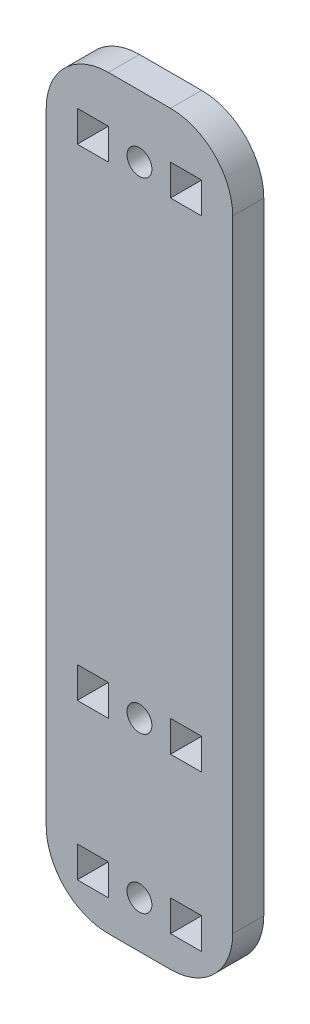
ISO-10303-21;
HEADER;
FILE_DESCRIPTION(('STEP AP214'),'2;1');
FILE_NAME('part.step','',(''),(''),'','','');
FILE_SCHEMA(('AUTOMOTIVE_DESIGN { 1 0 10303 214 1 1 1 1 }'));
ENDSEC;
DATA;
#1=APPLICATION_CONTEXT('core data for automotive mechanical design processes');
#2=APPLICATION_PROTOCOL_DEFINITION('international standard','automotive_design',2000,#1);
#3=PRODUCT_CONTEXT('',#1,'mechanical');
#4=PRODUCT('Part','Part','',(#3));
#5=PRODUCT_RELATED_PRODUCT_CATEGORY('part','',(#4));
#6=PRODUCT_DEFINITION_FORMATION('','',#4);
#7=PRODUCT_DEFINITION_CONTEXT('part definition',#1,'design');
#8=PRODUCT_DEFINITION('design','',#6,#7);
#9=PRODUCT_DEFINITION_SHAPE('','',#8);
#10=(LENGTH_UNIT() NAMED_UNIT(*) SI_UNIT(.MILLI.,.METRE.));
#11=(NAMED_UNIT(*) PLANE_ANGLE_UNIT() SI_UNIT($,.RADIAN.));
#12=(NAMED_UNIT(*) SI_UNIT($,.STERADIAN.) SOLID_ANGLE_UNIT());
#13=UNCERTAINTY_MEASURE_WITH_UNIT(LENGTH_MEASURE(1.E-05),#10,'distance_accuracy_value','');
#14=(GEOMETRIC_REPRESENTATION_CONTEXT(3) GLOBAL_UNCERTAINTY_ASSIGNED_CONTEXT((#13)) GLOBAL_UNIT_ASSIGNED_CONTEXT((#10,
#11,#12)) REPRESENTATION_CONTEXT('',''));
#15=CARTESIAN_POINT('',(0.,0.,0.));
#16=DIRECTION('',(0.,0.,1.));
#17=DIRECTION('',(1.,0.,0.));
#18=AXIS2_PLACEMENT_3D('',#15,#16,#17);
#19=CARTESIAN_POINT('',(0.,0.,5.));
#20=DIRECTION('',(0.,0.,1.));
#21=DIRECTION('',(1.,0.,0.));
#22=AXIS2_PLACEMENT_3D('',#19,#20,#21);
#23=PLANE('',#22);
#24=CARTESIAN_POINT('',(-15.,-87.5,5.));
#25=DIRECTION('',(0.,0.,1.));
#26=DIRECTION('',(1.,0.,0.));
#27=AXIS2_PLACEMENT_3D('',#24,#25,#26);
#28=CIRCLE('',#27,2.);
#29=CARTESIAN_POINT('',(-13.,-87.5,5.));
#30=VERTEX_POINT('',#29);
#31=EDGE_CURVE('E990',#30,#30,#28,.T.);
#32=ORIENTED_EDGE('',*,*,#31,.F.);
#33=EDGE_LOOP('',(#32));
#34=FACE_BOUND('',#33,.T.);
#35=DIRECTION('',(-1.,0.,0.));
#36=VECTOR('',#35,1.);
#37=CARTESIAN_POINT('',(-5.,-7.5,5.));
#38=LINE('',#37,#36);
#39=CARTESIAN_POINT('',(-5.,-7.5,5.));
#40=VERTEX_POINT('',#39);
#41=CARTESIAN_POINT('',(-10.,-7.5,5.));
#42=VERTEX_POINT('',#41);
#43=EDGE_CURVE('E262',#40,#42,#38,.T.);
#44=ORIENTED_EDGE('',*,*,#43,.F.);
#45=DIRECTION('',(0.,1.,0.));
#46=VECTOR('',#45,1.);
#47=CARTESIAN_POINT('',(-5.,-7.5,5.));
#48=LINE('',#47,#46);
#49=CARTESIAN_POINT('',(-5.,-12.5,5.));
#50=VERTEX_POINT('',#49);
#51=EDGE_CURVE('E251',#50,#40,#48,.T.);
#52=ORIENTED_EDGE('',*,*,#51,.F.);
#53=DIRECTION('',(1.,0.,0.));
#54=VECTOR('',#53,1.);
#55=CARTESIAN_POINT('',(-5.,-12.5,5.));
#56=LINE('',#55,#54);
#57=CARTESIAN_POINT('',(-10.,-12.5,5.));
#58=VERTEX_POINT('',#57);
#59=EDGE_CURVE('E281',#58,#50,#56,.T.);
#60=ORIENTED_EDGE('',*,*,#59,.F.);
#61=DIRECTION('',(0.,-1.,0.));
#62=VECTOR('',#61,1.);
#63=CARTESIAN_POINT('',(-10.,-7.5,5.));
#64=LINE('',#63,#62);
#65=EDGE_CURVE('E277',#42,#58,#64,.T.);
#66=ORIENTED_EDGE('',*,*,#65,.F.);
#67=EDGE_LOOP('',(#44,#52,#60,#66));
#68=FACE_BOUND('',#67,.T.);
#69=DIRECTION('',(-1.,0.,0.));
#70=VECTOR('',#69,1.);
#71=CARTESIAN_POINT('',(-20.,-7.5,5.));
#72=LINE('',#71,#70);
#73=CARTESIAN_POINT('',(-20.,-7.5,5.));
#74=VERTEX_POINT('',#73);
#75=CARTESIAN_POINT('',(-25.,-7.50000000000001,5.));
#76=VERTEX_POINT('',#75);
#77=EDGE_CURVE('E310',#74,#76,#72,.T.);
#78=ORIENTED_EDGE('',*,*,#77,.F.);
#79=DIRECTION('',(0.,1.,0.));
#80=VECTOR('',#79,1.);
#81=CARTESIAN_POINT('',(-20.,-7.5,5.));
#82=LINE('',#81,#80);
#83=CARTESIAN_POINT('',(-20.,-12.5,5.));
#84=VERTEX_POINT('',#83);
#85=EDGE_CURVE('E307',#84,#74,#82,.T.);
#86=ORIENTED_EDGE('',*,*,#85,.F.);
#87=DIRECTION('',(1.,0.,0.));
#88=VECTOR('',#87,1.);
#89=CARTESIAN_POINT('',(-20.,-12.5,5.));
#90=LINE('',#89,#88);
#91=CARTESIAN_POINT('',(-25.,-12.5,5.));
#92=VERTEX_POINT('',#91);
#93=EDGE_CURVE('E318',#92,#84,#90,.T.);
#94=ORIENTED_EDGE('',*,*,#93,.F.);
#95=DIRECTION('',(0.,-1.,0.));
#96=VECTOR('',#95,1.);
#97=CARTESIAN_POINT('',(-25.,-7.50000000000001,5.));
#98=LINE('',#97,#96);
#99=EDGE_CURVE('E314',#76,#92,#98,.T.);
#100=ORIENTED_EDGE('',*,*,#99,.F.);
#101=EDGE_LOOP('',(#78,#86,#94,#100));
#102=FACE_BOUND('',#101,.T.);
#103=DIRECTION('',(-1.,0.,0.));
#104=VECTOR('',#103,1.);
#105=CARTESIAN_POINT('',(-5.,-85.,5.));
#106=LINE('',#105,#104);
#107=CARTESIAN_POINT('',(-5.,-85.,5.));
#108=VERTEX_POINT('',#107);
#109=CARTESIAN_POINT('',(-10.,-85.,5.));
#110=VERTEX_POINT('',#109);
#111=EDGE_CURVE('E353',#108,#110,#106,.T.);
#112=ORIENTED_EDGE('',*,*,#111,.F.);
#113=DIRECTION('',(0.,1.,0.));
#114=VECTOR('',#113,1.);
#115=CARTESIAN_POINT('',(-5.,-85.,5.));
#116=LINE('',#115,#114);
#117=CARTESIAN_POINT('',(-5.,-90.,5.));
#118=VERTEX_POINT('',#117);
#119=EDGE_CURVE('E350',#118,#108,#116,.T.);
#120=ORIENTED_EDGE('',*,*,#119,.F.);
#121=DIRECTION('',(1.,0.,0.));
#122=VECTOR('',#121,1.);
#123=CARTESIAN_POINT('',(-5.,-90.,5.));
#124=LINE('',#123,#122);
#125=CARTESIAN_POINT('',(-10.,-90.,5.));
#126=VERTEX_POINT('',#125);
#127=EDGE_CURVE('E361',#126,#118,#124,.T.);
#128=ORIENTED_EDGE('',*,*,#127,.F.);
#129=DIRECTION('',(0.,-1.,0.));
#130=VECTOR('',#129,1.);
#131=CARTESIAN_POINT('',(-10.,-85.,5.));
#132=LINE('',#131,#130);
#133=EDGE_CURVE('E357',#110,#126,#132,.T.);
#134=ORIENTED_EDGE('',*,*,#133,.F.);
#135=EDGE_LOOP('',(#112,#120,#128,#134));
#136=FACE_BOUND('',#135,.T.);
#137=DIRECTION('',(-1.,0.,0.));
#138=VECTOR('',#137,1.);
#139=CARTESIAN_POINT('',(-20.,-85.,5.));
#140=LINE('',#139,#138);
#141=CARTESIAN_POINT('',(-20.,-85.,5.));
#142=VERTEX_POINT('',#141);
#143=CARTESIAN_POINT('',(-25.,-85.,5.));
#144=VERTEX_POINT('',#143);
#145=EDGE_CURVE('E396',#142,#144,#140,.T.);
#146=ORIENTED_EDGE('',*,*,#145,.F.);
#147=DIRECTION('',(0.,1.,0.));
#148=VECTOR('',#147,1.);
#149=CARTESIAN_POINT('',(-20.,-85.,5.));
#150=LINE('',#149,#148);
#151=CARTESIAN_POINT('',(-20.,-90.,5.));
#152=VERTEX_POINT('',#151);
#153=EDGE_CURVE('E393',#152,#142,#150,.T.);
#154=ORIENTED_EDGE('',*,*,#153,.F.);
#155=DIRECTION('',(1.,0.,0.));
#156=VECTOR('',#155,1.);
#157=CARTESIAN_POINT('',(-20.,-90.,5.));
#158=LINE('',#157,#156);
#159=CARTESIAN_POINT('',(-25.,-90.,5.));
#160=VERTEX_POINT('',#159);
#161=EDGE_CURVE('E404',#160,#152,#158,.T.);
#162=ORIENTED_EDGE('',*,*,#161,.F.);
#163=DIRECTION('',(0.,-1.,0.));
#164=VECTOR('',#163,1.);
#165=CARTESIAN_POINT('',(-25.,-85.,5.));
#166=LINE('',#165,#164);
#167=EDGE_CURVE('E400',#144,#160,#166,.T.);
#168=ORIENTED_EDGE('',*,*,#167,.F.);
#169=EDGE_LOOP('',(#146,#154,#162,#168));
#170=FACE_BOUND('',#169,.T.);
#171=DIRECTION('',(-1.,0.,0.));
#172=VECTOR('',#171,1.);
#173=CARTESIAN_POINT('',(-20.,-110.,5.));
#174=LINE('',#173,#172);
#175=CARTESIAN_POINT('',(-20.,-110.,5.));
#176=VERTEX_POINT('',#175);
#177=CARTESIAN_POINT('',(-25.,-110.,5.));
#178=VERTEX_POINT('',#177);
#179=EDGE_CURVE('E439',#176,#178,#174,.T.);
#180=ORIENTED_EDGE('',*,*,#179,.F.);
#181=DIRECTION('',(0.,1.,0.));
#182=VECTOR('',#181,1.);
#183=CARTESIAN_POINT('',(-20.,-110.,5.));
#184=LINE('',#183,#182);
#185=CARTESIAN_POINT('',(-20.,-115.,5.));
#186=VERTEX_POINT('',#185);
#187=EDGE_CURVE('E436',#186,#176,#184,.T.);
#188=ORIENTED_EDGE('',*,*,#187,.F.);
#189=DIRECTION('',(1.,0.,0.));
#190=VECTOR('',#189,1.);
#191=CARTESIAN_POINT('',(-20.,-115.,5.));
#192=LINE('',#191,#190);
#193=CARTESIAN_POINT('',(-25.,-115.,5.));
#194=VERTEX_POINT('',#193);
#195=EDGE_CURVE('E447',#194,#186,#192,.T.);
#196=ORIENTED_EDGE('',*,*,#195,.F.);
#197=DIRECTION('',(0.,-1.,0.));
#198=VECTOR('',#197,1.);
#199=CARTESIAN_POINT('',(-25.,-110.,5.));
#200=LINE('',#199,#198);
#201=EDGE_CURVE('E443',#178,#194,#200,.T.);
#202=ORIENTED_EDGE('',*,*,#201,.F.);
#203=EDGE_LOOP('',(#180,#188,#196,#202));
#204=FACE_BOUND('',#203,.T.);
#205=DIRECTION('',(-1.,0.,0.));
#206=VECTOR('',#205,1.);
#207=CARTESIAN_POINT('',(-4.99999999999999,-110.,5.));
#208=LINE('',#207,#206);
#209=CARTESIAN_POINT('',(-4.99999999999999,-110.,5.));
#210=VERTEX_POINT('',#209);
#211=CARTESIAN_POINT('',(-10.,-110.,5.));
#212=VERTEX_POINT('',#211);
#213=EDGE_CURVE('E482',#210,#212,#208,.T.);
#214=ORIENTED_EDGE('',*,*,#213,.F.);
#215=DIRECTION('',(0.,1.,0.));
#216=VECTOR('',#215,1.);
#217=CARTESIAN_POINT('',(-4.99999999999999,-110.,5.));
#218=LINE('',#217,#216);
#219=CARTESIAN_POINT('',(-4.99999999999999,-115.,5.));
#220=VERTEX_POINT('',#219);
#221=EDGE_CURVE('E479',#220,#210,#218,.T.);
#222=ORIENTED_EDGE('',*,*,#221,.F.);
#223=DIRECTION('',(1.,0.,0.));
#224=VECTOR('',#223,1.);
#225=CARTESIAN_POINT('',(-4.99999999999999,-115.,5.));
#226=LINE('',#225,#224);
#227=CARTESIAN_POINT('',(-10.,-115.,5.));
#228=VERTEX_POINT('',#227);
#229=EDGE_CURVE('E490',#228,#220,#226,.T.);
#230=ORIENTED_EDGE('',*,*,#229,.F.);
#231=DIRECTION('',(0.,-1.,0.));
#232=VECTOR('',#231,1.);
#233=CARTESIAN_POINT('',(-10.,-110.,5.));
#234=LINE('',#233,#232);
#235=EDGE_CURVE('E486',#212,#228,#234,.T.);
#236=ORIENTED_EDGE('',*,*,#235,.F.);
#237=EDGE_LOOP('',(#214,#222,#230,#236));
#238=FACE_BOUND('',#237,.T.);
#239=DIRECTION('',(0.,-1.,0.));
#240=VECTOR('',#239,1.);
#241=CARTESIAN_POINT('',(-30.,-120.,5.));
#242=LINE('',#241,#240);
#243=CARTESIAN_POINT('',(-30.,-9.99999999999999,5.));
#244=VERTEX_POINT('',#243);
#245=CARTESIAN_POINT('',(-30.,-110.,5.));
#246=VERTEX_POINT('',#245);
#247=EDGE_CURVE('E522',#244,#246,#242,.T.);
#248=ORIENTED_EDGE('',*,*,#247,.T.);
#249=CARTESIAN_POINT('',(-20.,-110.,5.));
#250=DIRECTION('',(0.,0.,1.));
#251=DIRECTION('',(1.,0.,0.));
#252=AXIS2_PLACEMENT_3D('',#249,#250,#251);
#253=CIRCLE('',#252,10.);
#254=CARTESIAN_POINT('',(-20.,-120.,5.));
#255=VERTEX_POINT('',#254);
#256=EDGE_CURVE('E584',#246,#255,#253,.T.);
#257=ORIENTED_EDGE('',*,*,#256,.T.);
#258=DIRECTION('',(1.,0.,0.));
#259=VECTOR('',#258,1.);
#260=CARTESIAN_POINT('',(0.,-120.,5.));
#261=LINE('',#260,#259);
#262=CARTESIAN_POINT('',(-10.,-120.,5.));
#263=VERTEX_POINT('',#262);
#264=EDGE_CURVE('E526',#255,#263,#261,.T.);
#265=ORIENTED_EDGE('',*,*,#264,.T.);
#266=CARTESIAN_POINT('',(-10.,-110.,5.));
#267=DIRECTION('',(0.,0.,1.));
#268=DIRECTION('',(1.,0.,0.));
#269=AXIS2_PLACEMENT_3D('',#266,#267,#268);
#270=CIRCLE('',#269,10.);
#271=CARTESIAN_POINT('',(0.,-110.,5.));
#272=VERTEX_POINT('',#271);
#273=EDGE_CURVE('E581',#263,#272,#270,.T.);
#274=ORIENTED_EDGE('',*,*,#273,.T.);
#275=DIRECTION('',(0.,1.,0.));
#276=VECTOR('',#275,1.);
#277=CARTESIAN_POINT('',(0.,-120.,5.));
#278=LINE('',#277,#276);
#279=CARTESIAN_POINT('',(0.,-10.,5.));
#280=VERTEX_POINT('',#279);
#281=EDGE_CURVE('E531',#272,#280,#278,.T.);
#282=ORIENTED_EDGE('',*,*,#281,.T.);
#283=CARTESIAN_POINT('',(-10.,-10.,5.));
#284=DIRECTION('',(0.,0.,1.));
#285=DIRECTION('',(1.,0.,0.));
#286=AXIS2_PLACEMENT_3D('',#283,#284,#285);
#287=CIRCLE('',#286,10.);
#288=CARTESIAN_POINT('',(-10.,0.,5.));
#289=VERTEX_POINT('',#288);
#290=EDGE_CURVE('E61',#280,#289,#287,.T.);
#291=ORIENTED_EDGE('',*,*,#290,.T.);
#292=DIRECTION('',(-1.,0.,0.));
#293=VECTOR('',#292,1.);
#294=CARTESIAN_POINT('',(0.,0.,5.));
#295=LINE('',#294,#293);
#296=CARTESIAN_POINT('',(-20.,0.,5.));
#297=VERTEX_POINT('',#296);
#298=EDGE_CURVE('E534',#289,#297,#295,.T.);
#299=ORIENTED_EDGE('',*,*,#298,.T.);
#300=CARTESIAN_POINT('',(-20.,-9.99999999999999,5.));
#301=DIRECTION('',(0.,0.,1.));
#302=DIRECTION('',(1.,0.,0.));
#303=AXIS2_PLACEMENT_3D('',#300,#301,#302);
#304=CIRCLE('',#303,10.);
#305=EDGE_CURVE('E576',#297,#244,#304,.T.);
#306=ORIENTED_EDGE('',*,*,#305,.T.);
#307=EDGE_LOOP('',(#248,#257,#265,#274,#282,#291,#299,#306));
#308=FACE_BOUND('',#307,.T.);
#309=CARTESIAN_POINT('',(-15.,-10.,5.));
#310=DIRECTION('',(0.,0.,1.));
#311=DIRECTION('',(1.,0.,0.));
#312=AXIS2_PLACEMENT_3D('',#309,#310,#311);
#313=CIRCLE('',#312,2.);
#314=CARTESIAN_POINT('',(-13.,-10.,5.));
#315=VERTEX_POINT('',#314);
#316=EDGE_CURVE('E290',#315,#315,#313,.T.);
#317=ORIENTED_EDGE('',*,*,#316,.F.);
#318=EDGE_LOOP('',(#317));
#319=FACE_BOUND('',#318,.T.);
#320=CARTESIAN_POINT('',(-15.,-112.5,5.));
#321=DIRECTION('',(0.,0.,1.));
#322=DIRECTION('',(1.,0.,0.));
#323=AXIS2_PLACEMENT_3D('',#320,#321,#322);
#324=CIRCLE('',#323,2.);
#325=CARTESIAN_POINT('',(-13.,-112.5,5.));
#326=VERTEX_POINT('',#325);
#327=EDGE_CURVE('E979',#326,#326,#324,.T.);
#328=ORIENTED_EDGE('',*,*,#327,.F.);
#329=EDGE_LOOP('',(#328));
#330=FACE_BOUND('',#329,.T.);
#331=ADVANCED_FACE('F39',(#34,#68,#102,#136,#170,#204,#238,#308,#319,#330),#23,.T.);
#332=CARTESIAN_POINT('',(0.,0.,0.));
#333=DIRECTION('',(0.,0.,1.));
#334=DIRECTION('',(1.,0.,0.));
#335=AXIS2_PLACEMENT_3D('',#332,#333,#334);
#336=PLANE('',#335);
#337=DIRECTION('',(0.,1.,0.));
#338=VECTOR('',#337,1.);
#339=CARTESIAN_POINT('',(-20.,-7.5,0.));
#340=LINE('',#339,#338);
#341=CARTESIAN_POINT('',(-20.,-12.5,0.));
#342=VERTEX_POINT('',#341);
#343=CARTESIAN_POINT('',(-20.,-7.5,0.));
#344=VERTEX_POINT('',#343);
#345=EDGE_CURVE('E271',#342,#344,#340,.T.);
#346=ORIENTED_EDGE('',*,*,#345,.T.);
#347=DIRECTION('',(-1.,0.,0.));
#348=VECTOR('',#347,1.);
#349=CARTESIAN_POINT('',(-20.,-7.5,0.));
#350=LINE('',#349,#348);
#351=CARTESIAN_POINT('',(-25.,-7.50000000000001,0.));
#352=VERTEX_POINT('',#351);
#353=EDGE_CURVE('E325',#344,#352,#350,.T.);
#354=ORIENTED_EDGE('',*,*,#353,.T.);
#355=DIRECTION('',(0.,-1.,0.));
#356=VECTOR('',#355,1.);
#357=CARTESIAN_POINT('',(-25.,-7.50000000000001,0.));
#358=LINE('',#357,#356);
#359=CARTESIAN_POINT('',(-25.,-12.5,0.));
#360=VERTEX_POINT('',#359);
#361=EDGE_CURVE('E329',#352,#360,#358,.T.);
#362=ORIENTED_EDGE('',*,*,#361,.T.);
#363=DIRECTION('',(1.,0.,0.));
#364=VECTOR('',#363,1.);
#365=CARTESIAN_POINT('',(-20.,-12.5,0.));
#366=LINE('',#365,#364);
#367=EDGE_CURVE('E311',#360,#342,#366,.T.);
#368=ORIENTED_EDGE('',*,*,#367,.T.);
#369=EDGE_LOOP('',(#346,#354,#362,#368));
#370=FACE_BOUND('',#369,.T.);
#371=DIRECTION('',(0.,1.,0.));
#372=VECTOR('',#371,1.);
#373=CARTESIAN_POINT('',(-20.,-85.,0.));
#374=LINE('',#373,#372);
#375=CARTESIAN_POINT('',(-20.,-90.,0.));
#376=VERTEX_POINT('',#375);
#377=CARTESIAN_POINT('',(-20.,-85.,0.));
#378=VERTEX_POINT('',#377);
#379=EDGE_CURVE('E392',#376,#378,#374,.T.);
#380=ORIENTED_EDGE('',*,*,#379,.T.);
#381=DIRECTION('',(-1.,0.,0.));
#382=VECTOR('',#381,1.);
#383=CARTESIAN_POINT('',(-20.,-85.,0.));
#384=LINE('',#383,#382);
#385=CARTESIAN_POINT('',(-25.,-85.,0.));
#386=VERTEX_POINT('',#385);
#387=EDGE_CURVE('E411',#378,#386,#384,.T.);
#388=ORIENTED_EDGE('',*,*,#387,.T.);
#389=DIRECTION('',(0.,-1.,0.));
#390=VECTOR('',#389,1.);
#391=CARTESIAN_POINT('',(-25.,-85.,0.));
#392=LINE('',#391,#390);
#393=CARTESIAN_POINT('',(-25.,-90.,0.));
#394=VERTEX_POINT('',#393);
#395=EDGE_CURVE('E415',#386,#394,#392,.T.);
#396=ORIENTED_EDGE('',*,*,#395,.T.);
#397=DIRECTION('',(1.,0.,0.));
#398=VECTOR('',#397,1.);
#399=CARTESIAN_POINT('',(-20.,-90.,0.));
#400=LINE('',#399,#398);
#401=EDGE_CURVE('E397',#394,#376,#400,.T.);
#402=ORIENTED_EDGE('',*,*,#401,.T.);
#403=EDGE_LOOP('',(#380,#388,#396,#402));
#404=FACE_BOUND('',#403,.T.);
#405=DIRECTION('',(0.,1.,0.));
#406=VECTOR('',#405,1.);
#407=CARTESIAN_POINT('',(-4.99999999999999,-110.,0.));
#408=LINE('',#407,#406);
#409=CARTESIAN_POINT('',(-4.99999999999999,-115.,0.));
#410=VERTEX_POINT('',#409);
#411=CARTESIAN_POINT('',(-4.99999999999999,-110.,0.));
#412=VERTEX_POINT('',#411);
#413=EDGE_CURVE('E478',#410,#412,#408,.T.);
#414=ORIENTED_EDGE('',*,*,#413,.T.);
#415=DIRECTION('',(-1.,0.,0.));
#416=VECTOR('',#415,1.);
#417=CARTESIAN_POINT('',(-4.99999999999999,-110.,0.));
#418=LINE('',#417,#416);
#419=CARTESIAN_POINT('',(-10.,-110.,0.));
#420=VERTEX_POINT('',#419);
#421=EDGE_CURVE('E497',#412,#420,#418,.T.);
#422=ORIENTED_EDGE('',*,*,#421,.T.);
#423=DIRECTION('',(0.,-1.,0.));
#424=VECTOR('',#423,1.);
#425=CARTESIAN_POINT('',(-10.,-110.,0.));
#426=LINE('',#425,#424);
#427=CARTESIAN_POINT('',(-10.,-115.,0.));
#428=VERTEX_POINT('',#427);
#429=EDGE_CURVE('E501',#420,#428,#426,.T.);
#430=ORIENTED_EDGE('',*,*,#429,.T.);
#431=DIRECTION('',(1.,0.,0.));
#432=VECTOR('',#431,1.);
#433=CARTESIAN_POINT('',(-4.99999999999999,-115.,0.));
#434=LINE('',#433,#432);
#435=EDGE_CURVE('E483',#428,#410,#434,.T.);
#436=ORIENTED_EDGE('',*,*,#435,.T.);
#437=EDGE_LOOP('',(#414,#422,#430,#436));
#438=FACE_BOUND('',#437,.T.);
#439=DIRECTION('',(1.,0.,0.));
#440=VECTOR('',#439,1.);
#441=CARTESIAN_POINT('',(0.,-120.,0.));
#442=LINE('',#441,#440);
#443=CARTESIAN_POINT('',(-20.,-120.,0.));
#444=VERTEX_POINT('',#443);
#445=CARTESIAN_POINT('',(-10.,-120.,0.));
#446=VERTEX_POINT('',#445);
#447=EDGE_CURVE('E541',#444,#446,#442,.T.);
#448=ORIENTED_EDGE('',*,*,#447,.F.);
#449=CARTESIAN_POINT('',(-20.,-110.,0.));
#450=DIRECTION('',(0.,0.,1.));
#451=DIRECTION('',(1.,0.,0.));
#452=AXIS2_PLACEMENT_3D('',#449,#450,#451);
#453=CIRCLE('',#452,10.);
#454=CARTESIAN_POINT('',(-30.,-110.,0.));
#455=VERTEX_POINT('',#454);
#456=EDGE_CURVE('E566',#444,#455,#453,.F.);
#457=ORIENTED_EDGE('',*,*,#456,.T.);
#458=DIRECTION('',(0.,-1.,0.));
#459=VECTOR('',#458,1.);
#460=CARTESIAN_POINT('',(-30.,-120.,0.));
#461=LINE('',#460,#459);
#462=CARTESIAN_POINT('',(-30.,-9.99999999999999,0.));
#463=VERTEX_POINT('',#462);
#464=EDGE_CURVE('E521',#463,#455,#461,.T.);
#465=ORIENTED_EDGE('',*,*,#464,.F.);
#466=CARTESIAN_POINT('',(-20.,-9.99999999999999,0.));
#467=DIRECTION('',(0.,0.,1.));
#468=DIRECTION('',(1.,0.,0.));
#469=AXIS2_PLACEMENT_3D('',#466,#467,#468);
#470=CIRCLE('',#469,10.);
#471=CARTESIAN_POINT('',(-20.,0.,0.));
#472=VERTEX_POINT('',#471);
#473=EDGE_CURVE('E557',#463,#472,#470,.F.);
#474=ORIENTED_EDGE('',*,*,#473,.T.);
#475=DIRECTION('',(-1.,0.,0.));
#476=VECTOR('',#475,1.);
#477=CARTESIAN_POINT('',(0.,0.,0.));
#478=LINE('',#477,#476);
#479=CARTESIAN_POINT('',(-10.,0.,0.));
#480=VERTEX_POINT('',#479);
#481=EDGE_CURVE('E527',#480,#472,#478,.T.);
#482=ORIENTED_EDGE('',*,*,#481,.F.);
#483=CARTESIAN_POINT('',(-10.,-10.,0.));
#484=DIRECTION('',(0.,0.,1.));
#485=DIRECTION('',(1.,0.,0.));
#486=AXIS2_PLACEMENT_3D('',#483,#484,#485);
#487=CIRCLE('',#486,10.);
#488=CARTESIAN_POINT('',(0.,-10.,0.));
#489=VERTEX_POINT('',#488);
#490=EDGE_CURVE('E560',#480,#489,#487,.F.);
#491=ORIENTED_EDGE('',*,*,#490,.T.);
#492=DIRECTION('',(0.,1.,0.));
#493=VECTOR('',#492,1.);
#494=CARTESIAN_POINT('',(0.,-120.,0.));
#495=LINE('',#494,#493);
#496=CARTESIAN_POINT('',(0.,-110.,0.));
#497=VERTEX_POINT('',#496);
#498=EDGE_CURVE('E545',#497,#489,#495,.T.);
#499=ORIENTED_EDGE('',*,*,#498,.F.);
#500=CARTESIAN_POINT('',(-10.,-110.,0.));
#501=DIRECTION('',(0.,0.,1.));
#502=DIRECTION('',(1.,0.,0.));
#503=AXIS2_PLACEMENT_3D('',#500,#501,#502);
#504=CIRCLE('',#503,10.);
#505=EDGE_CURVE('E563',#497,#446,#504,.F.);
#506=ORIENTED_EDGE('',*,*,#505,.T.);
#507=EDGE_LOOP('',(#448,#457,#465,#474,#482,#491,#499,#506));
#508=FACE_BOUND('',#507,.T.);
#509=DIRECTION('',(0.,1.,0.));
#510=VECTOR('',#509,1.);
#511=CARTESIAN_POINT('',(-20.,-110.,0.));
#512=LINE('',#511,#510);
#513=CARTESIAN_POINT('',(-20.,-115.,0.));
#514=VERTEX_POINT('',#513);
#515=CARTESIAN_POINT('',(-20.,-110.,0.));
#516=VERTEX_POINT('',#515);
#517=EDGE_CURVE('E435',#514,#516,#512,.T.);
#518=ORIENTED_EDGE('',*,*,#517,.T.);
#519=DIRECTION('',(-1.,0.,0.));
#520=VECTOR('',#519,1.);
#521=CARTESIAN_POINT('',(-20.,-110.,0.));
#522=LINE('',#521,#520);
#523=CARTESIAN_POINT('',(-25.,-110.,0.));
#524=VERTEX_POINT('',#523);
#525=EDGE_CURVE('E454',#516,#524,#522,.T.);
#526=ORIENTED_EDGE('',*,*,#525,.T.);
#527=DIRECTION('',(0.,-1.,0.));
#528=VECTOR('',#527,1.);
#529=CARTESIAN_POINT('',(-25.,-110.,0.));
#530=LINE('',#529,#528);
#531=CARTESIAN_POINT('',(-25.,-115.,0.));
#532=VERTEX_POINT('',#531);
#533=EDGE_CURVE('E458',#524,#532,#530,.T.);
#534=ORIENTED_EDGE('',*,*,#533,.T.);
#535=DIRECTION('',(1.,0.,0.));
#536=VECTOR('',#535,1.);
#537=CARTESIAN_POINT('',(-20.,-115.,0.));
#538=LINE('',#537,#536);
#539=EDGE_CURVE('E440',#532,#514,#538,.T.);
#540=ORIENTED_EDGE('',*,*,#539,.T.);
#541=EDGE_LOOP('',(#518,#526,#534,#540));
#542=FACE_BOUND('',#541,.T.);
#543=DIRECTION('',(0.,1.,0.));
#544=VECTOR('',#543,1.);
#545=CARTESIAN_POINT('',(-5.,-85.,0.));
#546=LINE('',#545,#544);
#547=CARTESIAN_POINT('',(-5.,-90.,0.));
#548=VERTEX_POINT('',#547);
#549=CARTESIAN_POINT('',(-5.,-85.,0.));
#550=VERTEX_POINT('',#549);
#551=EDGE_CURVE('E349',#548,#550,#546,.T.);
#552=ORIENTED_EDGE('',*,*,#551,.T.);
#553=DIRECTION('',(-1.,0.,0.));
#554=VECTOR('',#553,1.);
#555=CARTESIAN_POINT('',(-5.,-85.,0.));
#556=LINE('',#555,#554);
#557=CARTESIAN_POINT('',(-10.,-85.,0.));
#558=VERTEX_POINT('',#557);
#559=EDGE_CURVE('E368',#550,#558,#556,.T.);
#560=ORIENTED_EDGE('',*,*,#559,.T.);
#561=DIRECTION('',(0.,-1.,0.));
#562=VECTOR('',#561,1.);
#563=CARTESIAN_POINT('',(-10.,-85.,0.));
#564=LINE('',#563,#562);
#565=CARTESIAN_POINT('',(-10.,-90.,0.));
#566=VERTEX_POINT('',#565);
#567=EDGE_CURVE('E372',#558,#566,#564,.T.);
#568=ORIENTED_EDGE('',*,*,#567,.T.);
#569=DIRECTION('',(1.,0.,0.));
#570=VECTOR('',#569,1.);
#571=CARTESIAN_POINT('',(-5.,-90.,0.));
#572=LINE('',#571,#570);
#573=EDGE_CURVE('E354',#566,#548,#572,.T.);
#574=ORIENTED_EDGE('',*,*,#573,.T.);
#575=EDGE_LOOP('',(#552,#560,#568,#574));
#576=FACE_BOUND('',#575,.T.);
#577=DIRECTION('',(0.,1.,0.));
#578=VECTOR('',#577,1.);
#579=CARTESIAN_POINT('',(-5.,-7.5,0.));
#580=LINE('',#579,#578);
#581=CARTESIAN_POINT('',(-5.,-12.5,0.));
#582=VERTEX_POINT('',#581);
#583=CARTESIAN_POINT('',(-5.,-7.5,0.));
#584=VERTEX_POINT('',#583);
#585=EDGE_CURVE('E287',#582,#584,#580,.T.);
#586=ORIENTED_EDGE('',*,*,#585,.T.);
#587=DIRECTION('',(-1.,0.,0.));
#588=VECTOR('',#587,1.);
#589=CARTESIAN_POINT('',(-5.,-7.5,0.));
#590=LINE('',#589,#588);
#591=CARTESIAN_POINT('',(-10.,-7.5,0.));
#592=VERTEX_POINT('',#591);
#593=EDGE_CURVE('E269',#584,#592,#590,.T.);
#594=ORIENTED_EDGE('',*,*,#593,.T.);
#595=DIRECTION('',(0.,-1.,0.));
#596=VECTOR('',#595,1.);
#597=CARTESIAN_POINT('',(-10.,-7.5,0.));
#598=LINE('',#597,#596);
#599=CARTESIAN_POINT('',(-10.,-12.5,0.));
#600=VERTEX_POINT('',#599);
#601=EDGE_CURVE('E293',#592,#600,#598,.T.);
#602=ORIENTED_EDGE('',*,*,#601,.T.);
#603=DIRECTION('',(1.,0.,0.));
#604=VECTOR('',#603,1.);
#605=CARTESIAN_POINT('',(-5.,-12.5,0.));
#606=LINE('',#605,#604);
#607=EDGE_CURVE('E263',#600,#582,#606,.T.);
#608=ORIENTED_EDGE('',*,*,#607,.T.);
#609=EDGE_LOOP('',(#586,#594,#602,#608));
#610=FACE_BOUND('',#609,.T.);
#611=CARTESIAN_POINT('',(-15.,-10.,0.));
#612=DIRECTION('',(0.,0.,1.));
#613=DIRECTION('',(1.,0.,0.));
#614=AXIS2_PLACEMENT_3D('',#611,#612,#613);
#615=CIRCLE('',#614,2.);
#616=CARTESIAN_POINT('',(-13.,-10.,0.));
#617=VERTEX_POINT('',#616);
#618=EDGE_CURVE('E994',#617,#617,#615,.T.);
#619=ORIENTED_EDGE('',*,*,#618,.T.);
#620=EDGE_LOOP('',(#619));
#621=FACE_BOUND('',#620,.T.);
#622=CARTESIAN_POINT('',(-15.,-87.5,0.));
#623=DIRECTION('',(0.,0.,1.));
#624=DIRECTION('',(1.,0.,0.));
#625=AXIS2_PLACEMENT_3D('',#622,#623,#624);
#626=CIRCLE('',#625,2.);
#627=CARTESIAN_POINT('',(-13.,-87.5,0.));
#628=VERTEX_POINT('',#627);
#629=EDGE_CURVE('E987',#628,#628,#626,.T.);
#630=ORIENTED_EDGE('',*,*,#629,.T.);
#631=EDGE_LOOP('',(#630));
#632=FACE_BOUND('',#631,.T.);
#633=CARTESIAN_POINT('',(-15.,-112.5,0.));
#634=DIRECTION('',(0.,0.,1.));
#635=DIRECTION('',(1.,0.,0.));
#636=AXIS2_PLACEMENT_3D('',#633,#634,#635);
#637=CIRCLE('',#636,2.);
#638=CARTESIAN_POINT('',(-13.,-112.5,0.));
#639=VERTEX_POINT('',#638);
#640=EDGE_CURVE('E982',#639,#639,#637,.T.);
#641=ORIENTED_EDGE('',*,*,#640,.T.);
#642=EDGE_LOOP('',(#641));
#643=FACE_BOUND('',#642,.T.);
#644=ADVANCED_FACE('F604',(#370,#404,#438,#508,#542,#576,#610,#621,#632,#643),#336,.F.);
#645=CARTESIAN_POINT('',(-30.,-120.,5.));
#646=DIRECTION('',(1.,0.,0.));
#647=DIRECTION('',(0.,1.,0.));
#648=AXIS2_PLACEMENT_3D('',#645,#646,#647);
#649=PLANE('',#648);
#650=ORIENTED_EDGE('',*,*,#464,.T.);
#651=DIRECTION('',(0.,0.,-1.));
#652=VECTOR('',#651,1.);
#653=CARTESIAN_POINT('',(-30.,-110.,5.));
#654=LINE('',#653,#652);
#655=EDGE_CURVE('E573',#455,#246,#654,.F.);
#656=ORIENTED_EDGE('',*,*,#655,.T.);
#657=ORIENTED_EDGE('',*,*,#247,.F.);
#658=DIRECTION('',(0.,0.,-1.));
#659=VECTOR('',#658,1.);
#660=CARTESIAN_POINT('',(-30.,-9.99999999999999,5.));
#661=LINE('',#660,#659);
#662=EDGE_CURVE('E569',#244,#463,#661,.T.);
#663=ORIENTED_EDGE('',*,*,#662,.T.);
#664=EDGE_LOOP('',(#650,#656,#657,#663));
#665=FACE_BOUND('',#664,.T.);
#666=ADVANCED_FACE('F618',(#665),#649,.F.);
#667=CARTESIAN_POINT('',(0.,-120.,5.));
#668=DIRECTION('',(0.,1.,0.));
#669=DIRECTION('',(0.,0.,1.));
#670=AXIS2_PLACEMENT_3D('',#667,#668,#669);
#671=PLANE('',#670);
#672=ORIENTED_EDGE('',*,*,#264,.F.);
#673=DIRECTION('',(0.,0.,-1.));
#674=VECTOR('',#673,1.);
#675=CARTESIAN_POINT('',(-20.,-120.,5.));
#676=LINE('',#675,#674);
#677=EDGE_CURVE('E553',#255,#444,#676,.T.);
#678=ORIENTED_EDGE('',*,*,#677,.T.);
#679=ORIENTED_EDGE('',*,*,#447,.T.);
#680=DIRECTION('',(0.,0.,-1.));
#681=VECTOR('',#680,1.);
#682=CARTESIAN_POINT('',(-10.,-120.,5.));
#683=LINE('',#682,#681);
#684=EDGE_CURVE('E537',#446,#263,#683,.F.);
#685=ORIENTED_EDGE('',*,*,#684,.T.);
#686=EDGE_LOOP('',(#672,#678,#679,#685));
#687=FACE_BOUND('',#686,.T.);
#688=ADVANCED_FACE('F626',(#687),#671,.F.);
#689=CARTESIAN_POINT('',(0.,-120.,5.));
#690=DIRECTION('',(-1.,0.,0.));
#691=DIRECTION('',(0.,0.,1.));
#692=AXIS2_PLACEMENT_3D('',#689,#690,#691);
#693=PLANE('',#692);
#694=ORIENTED_EDGE('',*,*,#281,.F.);
#695=DIRECTION('',(0.,0.,-1.));
#696=VECTOR('',#695,1.);
#697=CARTESIAN_POINT('',(0.,-110.,5.));
#698=LINE('',#697,#696);
#699=EDGE_CURVE('E590',#272,#497,#698,.T.);
#700=ORIENTED_EDGE('',*,*,#699,.T.);
#701=ORIENTED_EDGE('',*,*,#498,.T.);
#702=DIRECTION('',(0.,0.,-1.));
#703=VECTOR('',#702,1.);
#704=CARTESIAN_POINT('',(0.,-10.,5.));
#705=LINE('',#704,#703);
#706=EDGE_CURVE('E587',#489,#280,#705,.F.);
#707=ORIENTED_EDGE('',*,*,#706,.T.);
#708=EDGE_LOOP('',(#694,#700,#701,#707));
#709=FACE_BOUND('',#708,.T.);
#710=ADVANCED_FACE('F598',(#709),#693,.F.);
#711=CARTESIAN_POINT('',(0.,0.,5.));
#712=DIRECTION('',(0.,-1.,0.));
#713=DIRECTION('',(1.,0.,0.));
#714=AXIS2_PLACEMENT_3D('',#711,#712,#713);
#715=PLANE('',#714);
#716=ORIENTED_EDGE('',*,*,#298,.F.);
#717=DIRECTION('',(0.,0.,-1.));
#718=VECTOR('',#717,1.);
#719=CARTESIAN_POINT('',(-10.,0.,5.));
#720=LINE('',#719,#718);
#721=EDGE_CURVE('E11',#289,#480,#720,.T.);
#722=ORIENTED_EDGE('',*,*,#721,.T.);
#723=ORIENTED_EDGE('',*,*,#481,.T.);
#724=DIRECTION('',(0.,0.,-1.));
#725=VECTOR('',#724,1.);
#726=CARTESIAN_POINT('',(-20.,0.,5.));
#727=LINE('',#726,#725);
#728=EDGE_CURVE('E48',#472,#297,#727,.F.);
#729=ORIENTED_EDGE('',*,*,#728,.T.);
#730=EDGE_LOOP('',(#716,#722,#723,#729));
#731=FACE_BOUND('',#730,.T.);
#732=ADVANCED_FACE('F610',(#731),#715,.F.);
#733=CARTESIAN_POINT('',(-4.99999999999999,-110.,5.));
#734=DIRECTION('',(-1.,0.,0.));
#735=DIRECTION('',(0.,0.,1.));
#736=AXIS2_PLACEMENT_3D('',#733,#734,#735);
#737=PLANE('',#736);
#738=ORIENTED_EDGE('',*,*,#413,.F.);
#739=DIRECTION('',(0.,0.,-1.));
#740=VECTOR('',#739,1.);
#741=CARTESIAN_POINT('',(-4.99999999999999,-115.,5.));
#742=LINE('',#741,#740);
#743=EDGE_CURVE('E493',#220,#410,#742,.T.);
#744=ORIENTED_EDGE('',*,*,#743,.F.);
#745=ORIENTED_EDGE('',*,*,#221,.T.);
#746=DIRECTION('',(0.,0.,-1.));
#747=VECTOR('',#746,1.);
#748=CARTESIAN_POINT('',(-4.99999999999999,-110.,5.));
#749=LINE('',#748,#747);
#750=EDGE_CURVE('E517',#210,#412,#749,.T.);
#751=ORIENTED_EDGE('',*,*,#750,.T.);
#752=EDGE_LOOP('',(#738,#744,#745,#751));
#753=FACE_BOUND('',#752,.T.);
#754=ADVANCED_FACE('F647',(#753),#737,.T.);
#755=CARTESIAN_POINT('',(-4.99999999999999,-110.,5.));
#756=DIRECTION('',(0.,-1.,0.));
#757=DIRECTION('',(1.,0.,0.));
#758=AXIS2_PLACEMENT_3D('',#755,#756,#757);
#759=PLANE('',#758);
#760=ORIENTED_EDGE('',*,*,#421,.F.);
#761=ORIENTED_EDGE('',*,*,#750,.F.);
#762=ORIENTED_EDGE('',*,*,#213,.T.);
#763=DIRECTION('',(0.,0.,-1.));
#764=VECTOR('',#763,1.);
#765=CARTESIAN_POINT('',(-10.,-110.,5.));
#766=LINE('',#765,#764);
#767=EDGE_CURVE('E514',#212,#420,#766,.T.);
#768=ORIENTED_EDGE('',*,*,#767,.T.);
#769=EDGE_LOOP('',(#760,#761,#762,#768));
#770=FACE_BOUND('',#769,.T.);
#771=ADVANCED_FACE('F680',(#770),#759,.T.);
#772=CARTESIAN_POINT('',(-10.,-110.,5.));
#773=DIRECTION('',(1.,0.,0.));
#774=DIRECTION('',(0.,0.,-1.));
#775=AXIS2_PLACEMENT_3D('',#772,#773,#774);
#776=PLANE('',#775);
#777=ORIENTED_EDGE('',*,*,#429,.F.);
#778=ORIENTED_EDGE('',*,*,#767,.F.);
#779=ORIENTED_EDGE('',*,*,#235,.T.);
#780=DIRECTION('',(0.,0.,-1.));
#781=VECTOR('',#780,1.);
#782=CARTESIAN_POINT('',(-10.,-115.,5.));
#783=LINE('',#782,#781);
#784=EDGE_CURVE('E511',#228,#428,#783,.T.);
#785=ORIENTED_EDGE('',*,*,#784,.T.);
#786=EDGE_LOOP('',(#777,#778,#779,#785));
#787=FACE_BOUND('',#786,.T.);
#788=ADVANCED_FACE('F687',(#787),#776,.T.);
#789=CARTESIAN_POINT('',(-4.99999999999999,-115.,5.));
#790=DIRECTION('',(0.,1.,0.));
#791=DIRECTION('',(-1.,0.,0.));
#792=AXIS2_PLACEMENT_3D('',#789,#790,#791);
#793=PLANE('',#792);
#794=ORIENTED_EDGE('',*,*,#435,.F.);
#795=ORIENTED_EDGE('',*,*,#784,.F.);
#796=ORIENTED_EDGE('',*,*,#229,.T.);
#797=ORIENTED_EDGE('',*,*,#743,.T.);
#798=EDGE_LOOP('',(#794,#795,#796,#797));
#799=FACE_BOUND('',#798,.T.);
#800=ADVANCED_FACE('F694',(#799),#793,.T.);
#801=CARTESIAN_POINT('',(-20.,-110.,5.));
#802=DIRECTION('',(-1.,0.,0.));
#803=DIRECTION('',(0.,0.,1.));
#804=AXIS2_PLACEMENT_3D('',#801,#802,#803);
#805=PLANE('',#804);
#806=ORIENTED_EDGE('',*,*,#517,.F.);
#807=DIRECTION('',(0.,0.,-1.));
#808=VECTOR('',#807,1.);
#809=CARTESIAN_POINT('',(-20.,-115.,5.));
#810=LINE('',#809,#808);
#811=EDGE_CURVE('E450',#186,#514,#810,.T.);
#812=ORIENTED_EDGE('',*,*,#811,.F.);
#813=ORIENTED_EDGE('',*,*,#187,.T.);
#814=DIRECTION('',(0.,0.,-1.));
#815=VECTOR('',#814,1.);
#816=CARTESIAN_POINT('',(-20.,-110.,5.));
#817=LINE('',#816,#815);
#818=EDGE_CURVE('E474',#176,#516,#817,.T.);
#819=ORIENTED_EDGE('',*,*,#818,.T.);
#820=EDGE_LOOP('',(#806,#812,#813,#819));
#821=FACE_BOUND('',#820,.T.);
#822=ADVANCED_FACE('F702',(#821),#805,.T.);
#823=CARTESIAN_POINT('',(-20.,-110.,5.));
#824=DIRECTION('',(0.,-1.,0.));
#825=DIRECTION('',(0.,0.,-1.));
#826=AXIS2_PLACEMENT_3D('',#823,#824,#825);
#827=PLANE('',#826);
#828=ORIENTED_EDGE('',*,*,#525,.F.);
#829=ORIENTED_EDGE('',*,*,#818,.F.);
#830=ORIENTED_EDGE('',*,*,#179,.T.);
#831=DIRECTION('',(0.,0.,-1.));
#832=VECTOR('',#831,1.);
#833=CARTESIAN_POINT('',(-25.,-110.,5.));
#834=LINE('',#833,#832);
#835=EDGE_CURVE('E471',#178,#524,#834,.T.);
#836=ORIENTED_EDGE('',*,*,#835,.T.);
#837=EDGE_LOOP('',(#828,#829,#830,#836));
#838=FACE_BOUND('',#837,.T.);
#839=ADVANCED_FACE('F710',(#838),#827,.T.);
#840=CARTESIAN_POINT('',(-25.,-110.,5.));
#841=DIRECTION('',(1.,0.,0.));
#842=DIRECTION('',(0.,0.,-1.));
#843=AXIS2_PLACEMENT_3D('',#840,#841,#842);
#844=PLANE('',#843);
#845=ORIENTED_EDGE('',*,*,#533,.F.);
#846=ORIENTED_EDGE('',*,*,#835,.F.);
#847=ORIENTED_EDGE('',*,*,#201,.T.);
#848=DIRECTION('',(0.,0.,-1.));
#849=VECTOR('',#848,1.);
#850=CARTESIAN_POINT('',(-25.,-115.,5.));
#851=LINE('',#850,#849);
#852=EDGE_CURVE('E468',#194,#532,#851,.T.);
#853=ORIENTED_EDGE('',*,*,#852,.T.);
#854=EDGE_LOOP('',(#845,#846,#847,#853));
#855=FACE_BOUND('',#854,.T.);
#856=ADVANCED_FACE('F718',(#855),#844,.T.);
#857=CARTESIAN_POINT('',(-20.,-115.,5.));
#858=DIRECTION('',(0.,1.,0.));
#859=DIRECTION('',(0.,0.,1.));
#860=AXIS2_PLACEMENT_3D('',#857,#858,#859);
#861=PLANE('',#860);
#862=ORIENTED_EDGE('',*,*,#539,.F.);
#863=ORIENTED_EDGE('',*,*,#852,.F.);
#864=ORIENTED_EDGE('',*,*,#195,.T.);
#865=ORIENTED_EDGE('',*,*,#811,.T.);
#866=EDGE_LOOP('',(#862,#863,#864,#865));
#867=FACE_BOUND('',#866,.T.);
#868=ADVANCED_FACE('F726',(#867),#861,.T.);
#869=CARTESIAN_POINT('',(-20.,-85.,5.));
#870=DIRECTION('',(-1.,0.,0.));
#871=DIRECTION('',(0.,0.,1.));
#872=AXIS2_PLACEMENT_3D('',#869,#870,#871);
#873=PLANE('',#872);
#874=ORIENTED_EDGE('',*,*,#379,.F.);
#875=DIRECTION('',(0.,0.,-1.));
#876=VECTOR('',#875,1.);
#877=CARTESIAN_POINT('',(-20.,-90.,5.));
#878=LINE('',#877,#876);
#879=EDGE_CURVE('E407',#152,#376,#878,.T.);
#880=ORIENTED_EDGE('',*,*,#879,.F.);
#881=ORIENTED_EDGE('',*,*,#153,.T.);
#882=DIRECTION('',(0.,0.,-1.));
#883=VECTOR('',#882,1.);
#884=CARTESIAN_POINT('',(-20.,-85.,5.));
#885=LINE('',#884,#883);
#886=EDGE_CURVE('E431',#142,#378,#885,.T.);
#887=ORIENTED_EDGE('',*,*,#886,.T.);
#888=EDGE_LOOP('',(#874,#880,#881,#887));
#889=FACE_BOUND('',#888,.T.);
#890=ADVANCED_FACE('F734',(#889),#873,.T.);
#891=CARTESIAN_POINT('',(-20.,-85.,5.));
#892=DIRECTION('',(0.,-1.,0.));
#893=DIRECTION('',(0.,0.,-1.));
#894=AXIS2_PLACEMENT_3D('',#891,#892,#893);
#895=PLANE('',#894);
#896=ORIENTED_EDGE('',*,*,#387,.F.);
#897=ORIENTED_EDGE('',*,*,#886,.F.);
#898=ORIENTED_EDGE('',*,*,#145,.T.);
#899=DIRECTION('',(0.,0.,-1.));
#900=VECTOR('',#899,1.);
#901=CARTESIAN_POINT('',(-25.,-85.,5.));
#902=LINE('',#901,#900);
#903=EDGE_CURVE('E428',#144,#386,#902,.T.);
#904=ORIENTED_EDGE('',*,*,#903,.T.);
#905=EDGE_LOOP('',(#896,#897,#898,#904));
#906=FACE_BOUND('',#905,.T.);
#907=ADVANCED_FACE('F742',(#906),#895,.T.);
#908=CARTESIAN_POINT('',(-25.,-85.,5.));
#909=DIRECTION('',(1.,0.,0.));
#910=DIRECTION('',(0.,0.,-1.));
#911=AXIS2_PLACEMENT_3D('',#908,#909,#910);
#912=PLANE('',#911);
#913=ORIENTED_EDGE('',*,*,#395,.F.);
#914=ORIENTED_EDGE('',*,*,#903,.F.);
#915=ORIENTED_EDGE('',*,*,#167,.T.);
#916=DIRECTION('',(0.,0.,-1.));
#917=VECTOR('',#916,1.);
#918=CARTESIAN_POINT('',(-25.,-90.,5.));
#919=LINE('',#918,#917);
#920=EDGE_CURVE('E425',#160,#394,#919,.T.);
#921=ORIENTED_EDGE('',*,*,#920,.T.);
#922=EDGE_LOOP('',(#913,#914,#915,#921));
#923=FACE_BOUND('',#922,.T.);
#924=ADVANCED_FACE('F750',(#923),#912,.T.);
#925=CARTESIAN_POINT('',(-20.,-90.,5.));
#926=DIRECTION('',(0.,1.,0.));
#927=DIRECTION('',(0.,0.,1.));
#928=AXIS2_PLACEMENT_3D('',#925,#926,#927);
#929=PLANE('',#928);
#930=ORIENTED_EDGE('',*,*,#401,.F.);
#931=ORIENTED_EDGE('',*,*,#920,.F.);
#932=ORIENTED_EDGE('',*,*,#161,.T.);
#933=ORIENTED_EDGE('',*,*,#879,.T.);
#934=EDGE_LOOP('',(#930,#931,#932,#933));
#935=FACE_BOUND('',#934,.T.);
#936=ADVANCED_FACE('F758',(#935),#929,.T.);
#937=CARTESIAN_POINT('',(-5.,-85.,5.));
#938=DIRECTION('',(-1.,0.,0.));
#939=DIRECTION('',(0.,-1.,0.));
#940=AXIS2_PLACEMENT_3D('',#937,#938,#939);
#941=PLANE('',#940);
#942=ORIENTED_EDGE('',*,*,#551,.F.);
#943=DIRECTION('',(0.,0.,-1.));
#944=VECTOR('',#943,1.);
#945=CARTESIAN_POINT('',(-5.,-90.,5.));
#946=LINE('',#945,#944);
#947=EDGE_CURVE('E364',#118,#548,#946,.T.);
#948=ORIENTED_EDGE('',*,*,#947,.F.);
#949=ORIENTED_EDGE('',*,*,#119,.T.);
#950=DIRECTION('',(0.,0.,-1.));
#951=VECTOR('',#950,1.);
#952=CARTESIAN_POINT('',(-5.,-85.,5.));
#953=LINE('',#952,#951);
#954=EDGE_CURVE('E388',#108,#550,#953,.T.);
#955=ORIENTED_EDGE('',*,*,#954,.T.);
#956=EDGE_LOOP('',(#942,#948,#949,#955));
#957=FACE_BOUND('',#956,.T.);
#958=ADVANCED_FACE('F766',(#957),#941,.T.);
#959=CARTESIAN_POINT('',(-5.,-85.,5.));
#960=DIRECTION('',(0.,-1.,0.));
#961=DIRECTION('',(0.,0.,-1.));
#962=AXIS2_PLACEMENT_3D('',#959,#960,#961);
#963=PLANE('',#962);
#964=ORIENTED_EDGE('',*,*,#559,.F.);
#965=ORIENTED_EDGE('',*,*,#954,.F.);
#966=ORIENTED_EDGE('',*,*,#111,.T.);
#967=DIRECTION('',(0.,0.,-1.));
#968=VECTOR('',#967,1.);
#969=CARTESIAN_POINT('',(-10.,-85.,5.));
#970=LINE('',#969,#968);
#971=EDGE_CURVE('E385',#110,#558,#970,.T.);
#972=ORIENTED_EDGE('',*,*,#971,.T.);
#973=EDGE_LOOP('',(#964,#965,#966,#972));
#974=FACE_BOUND('',#973,.T.);
#975=ADVANCED_FACE('F774',(#974),#963,.T.);
#976=CARTESIAN_POINT('',(-10.,-85.,5.));
#977=DIRECTION('',(1.,0.,0.));
#978=DIRECTION('',(0.,0.,-1.));
#979=AXIS2_PLACEMENT_3D('',#976,#977,#978);
#980=PLANE('',#979);
#981=ORIENTED_EDGE('',*,*,#567,.F.);
#982=ORIENTED_EDGE('',*,*,#971,.F.);
#983=ORIENTED_EDGE('',*,*,#133,.T.);
#984=DIRECTION('',(0.,0.,-1.));
#985=VECTOR('',#984,1.);
#986=CARTESIAN_POINT('',(-10.,-90.,5.));
#987=LINE('',#986,#985);
#988=EDGE_CURVE('E382',#126,#566,#987,.T.);
#989=ORIENTED_EDGE('',*,*,#988,.T.);
#990=EDGE_LOOP('',(#981,#982,#983,#989));
#991=FACE_BOUND('',#990,.T.);
#992=ADVANCED_FACE('F782',(#991),#980,.T.);
#993=CARTESIAN_POINT('',(-5.,-90.,5.));
#994=DIRECTION('',(0.,1.,0.));
#995=DIRECTION('',(0.,0.,1.));
#996=AXIS2_PLACEMENT_3D('',#993,#994,#995);
#997=PLANE('',#996);
#998=ORIENTED_EDGE('',*,*,#573,.F.);
#999=ORIENTED_EDGE('',*,*,#988,.F.);
#1000=ORIENTED_EDGE('',*,*,#127,.T.);
#1001=ORIENTED_EDGE('',*,*,#947,.T.);
#1002=EDGE_LOOP('',(#998,#999,#1000,#1001));
#1003=FACE_BOUND('',#1002,.T.);
#1004=ADVANCED_FACE('F790',(#1003),#997,.T.);
#1005=CARTESIAN_POINT('',(-20.,-7.5,5.));
#1006=DIRECTION('',(-1.,0.,0.));
#1007=DIRECTION('',(0.,0.,1.));
#1008=AXIS2_PLACEMENT_3D('',#1005,#1006,#1007);
#1009=PLANE('',#1008);
#1010=ORIENTED_EDGE('',*,*,#345,.F.);
#1011=DIRECTION('',(0.,0.,-1.));
#1012=VECTOR('',#1011,1.);
#1013=CARTESIAN_POINT('',(-20.,-12.5,5.));
#1014=LINE('',#1013,#1012);
#1015=EDGE_CURVE('E321',#84,#342,#1014,.T.);
#1016=ORIENTED_EDGE('',*,*,#1015,.F.);
#1017=ORIENTED_EDGE('',*,*,#85,.T.);
#1018=DIRECTION('',(0.,0.,-1.));
#1019=VECTOR('',#1018,1.);
#1020=CARTESIAN_POINT('',(-20.,-7.5,5.));
#1021=LINE('',#1020,#1019);
#1022=EDGE_CURVE('E345',#74,#344,#1021,.T.);
#1023=ORIENTED_EDGE('',*,*,#1022,.T.);
#1024=EDGE_LOOP('',(#1010,#1016,#1017,#1023));
#1025=FACE_BOUND('',#1024,.T.);
#1026=ADVANCED_FACE('F798',(#1025),#1009,.T.);
#1027=CARTESIAN_POINT('',(-20.,-7.5,5.));
#1028=DIRECTION('',(0.,-1.,0.));
#1029=DIRECTION('',(1.,0.,0.));
#1030=AXIS2_PLACEMENT_3D('',#1027,#1028,#1029);
#1031=PLANE('',#1030);
#1032=ORIENTED_EDGE('',*,*,#353,.F.);
#1033=ORIENTED_EDGE('',*,*,#1022,.F.);
#1034=ORIENTED_EDGE('',*,*,#77,.T.);
#1035=DIRECTION('',(0.,0.,-1.));
#1036=VECTOR('',#1035,1.);
#1037=CARTESIAN_POINT('',(-25.,-7.50000000000001,5.));
#1038=LINE('',#1037,#1036);
#1039=EDGE_CURVE('E342',#76,#352,#1038,.T.);
#1040=ORIENTED_EDGE('',*,*,#1039,.T.);
#1041=EDGE_LOOP('',(#1032,#1033,#1034,#1040));
#1042=FACE_BOUND('',#1041,.T.);
#1043=ADVANCED_FACE('F806',(#1042),#1031,.T.);
#1044=CARTESIAN_POINT('',(-25.,-7.50000000000001,5.));
#1045=DIRECTION('',(1.,0.,0.));
#1046=DIRECTION('',(0.,0.,-1.));
#1047=AXIS2_PLACEMENT_3D('',#1044,#1045,#1046);
#1048=PLANE('',#1047);
#1049=ORIENTED_EDGE('',*,*,#361,.F.);
#1050=ORIENTED_EDGE('',*,*,#1039,.F.);
#1051=ORIENTED_EDGE('',*,*,#99,.T.);
#1052=DIRECTION('',(0.,0.,-1.));
#1053=VECTOR('',#1052,1.);
#1054=CARTESIAN_POINT('',(-25.,-12.5,5.));
#1055=LINE('',#1054,#1053);
#1056=EDGE_CURVE('E339',#92,#360,#1055,.T.);
#1057=ORIENTED_EDGE('',*,*,#1056,.T.);
#1058=EDGE_LOOP('',(#1049,#1050,#1051,#1057));
#1059=FACE_BOUND('',#1058,.T.);
#1060=ADVANCED_FACE('F814',(#1059),#1048,.T.);
#1061=CARTESIAN_POINT('',(-20.,-12.5,5.));
#1062=DIRECTION('',(0.,1.,0.));
#1063=DIRECTION('',(0.,0.,1.));
#1064=AXIS2_PLACEMENT_3D('',#1061,#1062,#1063);
#1065=PLANE('',#1064);
#1066=ORIENTED_EDGE('',*,*,#367,.F.);
#1067=ORIENTED_EDGE('',*,*,#1056,.F.);
#1068=ORIENTED_EDGE('',*,*,#93,.T.);
#1069=ORIENTED_EDGE('',*,*,#1015,.T.);
#1070=EDGE_LOOP('',(#1066,#1067,#1068,#1069));
#1071=FACE_BOUND('',#1070,.T.);
#1072=ADVANCED_FACE('F822',(#1071),#1065,.T.);
#1073=CARTESIAN_POINT('',(-5.,-7.5,5.));
#1074=DIRECTION('',(-1.,0.,0.));
#1075=DIRECTION('',(0.,-1.,0.));
#1076=AXIS2_PLACEMENT_3D('',#1073,#1074,#1075);
#1077=PLANE('',#1076);
#1078=ORIENTED_EDGE('',*,*,#585,.F.);
#1079=DIRECTION('',(0.,0.,-1.));
#1080=VECTOR('',#1079,1.);
#1081=CARTESIAN_POINT('',(-5.,-12.5,5.));
#1082=LINE('',#1081,#1080);
#1083=EDGE_CURVE('E257',#50,#582,#1082,.T.);
#1084=ORIENTED_EDGE('',*,*,#1083,.F.);
#1085=ORIENTED_EDGE('',*,*,#51,.T.);
#1086=DIRECTION('',(0.,0.,-1.));
#1087=VECTOR('',#1086,1.);
#1088=CARTESIAN_POINT('',(-5.,-7.5,5.));
#1089=LINE('',#1088,#1087);
#1090=EDGE_CURVE('E254',#40,#584,#1089,.T.);
#1091=ORIENTED_EDGE('',*,*,#1090,.T.);
#1092=EDGE_LOOP('',(#1078,#1084,#1085,#1091));
#1093=FACE_BOUND('',#1092,.T.);
#1094=ADVANCED_FACE('F253',(#1093),#1077,.T.);
#1095=CARTESIAN_POINT('',(-5.,-7.5,5.));
#1096=DIRECTION('',(0.,-1.,0.));
#1097=DIRECTION('',(1.,0.,0.));
#1098=AXIS2_PLACEMENT_3D('',#1095,#1096,#1097);
#1099=PLANE('',#1098);
#1100=ORIENTED_EDGE('',*,*,#593,.F.);
#1101=ORIENTED_EDGE('',*,*,#1090,.F.);
#1102=ORIENTED_EDGE('',*,*,#43,.T.);
#1103=DIRECTION('',(0.,0.,-1.));
#1104=VECTOR('',#1103,1.);
#1105=CARTESIAN_POINT('',(-10.,-7.5,5.));
#1106=LINE('',#1105,#1104);
#1107=EDGE_CURVE('E272',#42,#592,#1106,.T.);
#1108=ORIENTED_EDGE('',*,*,#1107,.T.);
#1109=EDGE_LOOP('',(#1100,#1101,#1102,#1108));
#1110=FACE_BOUND('',#1109,.T.);
#1111=ADVANCED_FACE('F266',(#1110),#1099,.T.);
#1112=CARTESIAN_POINT('',(-10.,-7.5,5.));
#1113=DIRECTION('',(1.,0.,0.));
#1114=DIRECTION('',(0.,0.,-1.));
#1115=AXIS2_PLACEMENT_3D('',#1112,#1113,#1114);
#1116=PLANE('',#1115);
#1117=ORIENTED_EDGE('',*,*,#601,.F.);
#1118=ORIENTED_EDGE('',*,*,#1107,.F.);
#1119=ORIENTED_EDGE('',*,*,#65,.T.);
#1120=DIRECTION('',(0.,0.,-1.));
#1121=VECTOR('',#1120,1.);
#1122=CARTESIAN_POINT('',(-10.,-12.5,5.));
#1123=LINE('',#1122,#1121);
#1124=EDGE_CURVE('E302',#58,#600,#1123,.T.);
#1125=ORIENTED_EDGE('',*,*,#1124,.T.);
#1126=EDGE_LOOP('',(#1117,#1118,#1119,#1125));
#1127=FACE_BOUND('',#1126,.T.);
#1128=ADVANCED_FACE('F843',(#1127),#1116,.T.);
#1129=CARTESIAN_POINT('',(-5.,-12.5,5.));
#1130=DIRECTION('',(0.,1.,0.));
#1131=DIRECTION('',(-1.,0.,0.));
#1132=AXIS2_PLACEMENT_3D('',#1129,#1130,#1131);
#1133=PLANE('',#1132);
#1134=ORIENTED_EDGE('',*,*,#607,.F.);
#1135=ORIENTED_EDGE('',*,*,#1124,.F.);
#1136=ORIENTED_EDGE('',*,*,#59,.T.);
#1137=ORIENTED_EDGE('',*,*,#1083,.T.);
#1138=EDGE_LOOP('',(#1134,#1135,#1136,#1137));
#1139=FACE_BOUND('',#1138,.T.);
#1140=ADVANCED_FACE('F850',(#1139),#1133,.T.);
#1141=CARTESIAN_POINT('',(-15.,-10.,5.));
#1142=DIRECTION('',(0.,0.,-1.));
#1143=DIRECTION('',(-1.,0.,0.));
#1144=AXIS2_PLACEMENT_3D('',#1141,#1142,#1143);
#1145=CYLINDRICAL_SURFACE('',#1144,2.);
#1146=ORIENTED_EDGE('',*,*,#316,.T.);
#1147=EDGE_LOOP('',(#1146));
#1148=FACE_BOUND('',#1147,.T.);
#1149=ORIENTED_EDGE('',*,*,#618,.F.);
#1150=EDGE_LOOP('',(#1149));
#1151=FACE_BOUND('',#1150,.T.);
#1152=ADVANCED_FACE('F858',(#1148,#1151),#1145,.F.);
#1153=CARTESIAN_POINT('',(-15.,-87.5,5.));
#1154=DIRECTION('',(0.,0.,-1.));
#1155=DIRECTION('',(-1.,0.,0.));
#1156=AXIS2_PLACEMENT_3D('',#1153,#1154,#1155);
#1157=CYLINDRICAL_SURFACE('',#1156,2.);
#1158=ORIENTED_EDGE('',*,*,#31,.T.);
#1159=EDGE_LOOP('',(#1158));
#1160=FACE_BOUND('',#1159,.T.);
#1161=ORIENTED_EDGE('',*,*,#629,.F.);
#1162=EDGE_LOOP('',(#1161));
#1163=FACE_BOUND('',#1162,.T.);
#1164=ADVANCED_FACE('F866',(#1160,#1163),#1157,.F.);
#1165=CARTESIAN_POINT('',(-15.,-112.5,5.));
#1166=DIRECTION('',(0.,0.,-1.));
#1167=DIRECTION('',(-1.,0.,0.));
#1168=AXIS2_PLACEMENT_3D('',#1165,#1166,#1167);
#1169=CYLINDRICAL_SURFACE('',#1168,2.);
#1170=ORIENTED_EDGE('',*,*,#327,.T.);
#1171=EDGE_LOOP('',(#1170));
#1172=FACE_BOUND('',#1171,.T.);
#1173=ORIENTED_EDGE('',*,*,#640,.F.);
#1174=EDGE_LOOP('',(#1173));
#1175=FACE_BOUND('',#1174,.T.);
#1176=ADVANCED_FACE('F635',(#1172,#1175),#1169,.F.);
#1177=CARTESIAN_POINT('',(-20.,-110.,5.));
#1178=DIRECTION('',(0.,0.,-1.));
#1179=DIRECTION('',(-1.,0.,0.));
#1180=AXIS2_PLACEMENT_3D('',#1177,#1178,#1179);
#1181=CYLINDRICAL_SURFACE('',#1180,10.);
#1182=ORIENTED_EDGE('',*,*,#256,.F.);
#1183=ORIENTED_EDGE('',*,*,#655,.F.);
#1184=ORIENTED_EDGE('',*,*,#456,.F.);
#1185=ORIENTED_EDGE('',*,*,#677,.F.);
#1186=EDGE_LOOP('',(#1182,#1183,#1184,#1185));
#1187=FACE_BOUND('',#1186,.T.);
#1188=ADVANCED_FACE('F623',(#1187),#1181,.T.);
#1189=CARTESIAN_POINT('',(-10.,-110.,5.));
#1190=DIRECTION('',(0.,0.,-1.));
#1191=DIRECTION('',(-1.,0.,0.));
#1192=AXIS2_PLACEMENT_3D('',#1189,#1190,#1191);
#1193=CYLINDRICAL_SURFACE('',#1192,10.);
#1194=ORIENTED_EDGE('',*,*,#273,.F.);
#1195=ORIENTED_EDGE('',*,*,#684,.F.);
#1196=ORIENTED_EDGE('',*,*,#505,.F.);
#1197=ORIENTED_EDGE('',*,*,#699,.F.);
#1198=EDGE_LOOP('',(#1194,#1195,#1196,#1197));
#1199=FACE_BOUND('',#1198,.T.);
#1200=ADVANCED_FACE('F628',(#1199),#1193,.T.);
#1201=CARTESIAN_POINT('',(-10.,-10.,5.));
#1202=DIRECTION('',(0.,0.,-1.));
#1203=DIRECTION('',(-1.,0.,0.));
#1204=AXIS2_PLACEMENT_3D('',#1201,#1202,#1203);
#1205=CYLINDRICAL_SURFACE('',#1204,10.);
#1206=ORIENTED_EDGE('',*,*,#290,.F.);
#1207=ORIENTED_EDGE('',*,*,#706,.F.);
#1208=ORIENTED_EDGE('',*,*,#490,.F.);
#1209=ORIENTED_EDGE('',*,*,#721,.F.);
#1210=EDGE_LOOP('',(#1206,#1207,#1208,#1209));
#1211=FACE_BOUND('',#1210,.T.);
#1212=ADVANCED_FACE('F609',(#1211),#1205,.T.);
#1213=CARTESIAN_POINT('',(-20.,-9.99999999999999,5.));
#1214=DIRECTION('',(0.,0.,-1.));
#1215=DIRECTION('',(-1.,0.,0.));
#1216=AXIS2_PLACEMENT_3D('',#1213,#1214,#1215);
#1217=CYLINDRICAL_SURFACE('',#1216,10.);
#1218=ORIENTED_EDGE('',*,*,#305,.F.);
#1219=ORIENTED_EDGE('',*,*,#728,.F.);
#1220=ORIENTED_EDGE('',*,*,#473,.F.);
#1221=ORIENTED_EDGE('',*,*,#662,.F.);
#1222=EDGE_LOOP('',(#1218,#1219,#1220,#1221));
#1223=FACE_BOUND('',#1222,.T.);
#1224=ADVANCED_FACE('F41',(#1223),#1217,.T.);
#1225=CLOSED_SHELL('',(#331,#644,#666,#688,#710,#732,#754,#771,#788,#800,#822,#839,#856,#868,
#890,#907,#924,#936,#958,#975,#992,#1004,#1026,#1043,#1060,#1072,#1094,#1111,#1128,#1140,#1152,
#1164,#1176,#1188,#1200,#1212,#1224));
#1226=MANIFOLD_SOLID_BREP('B2',#1225);
#1227=ADVANCED_BREP_SHAPE_REPRESENTATION('',(#18,#1226),#14);
#1228=SHAPE_DEFINITION_REPRESENTATION(#9,#1227);
ENDSEC;
END-ISO-10303-21;
